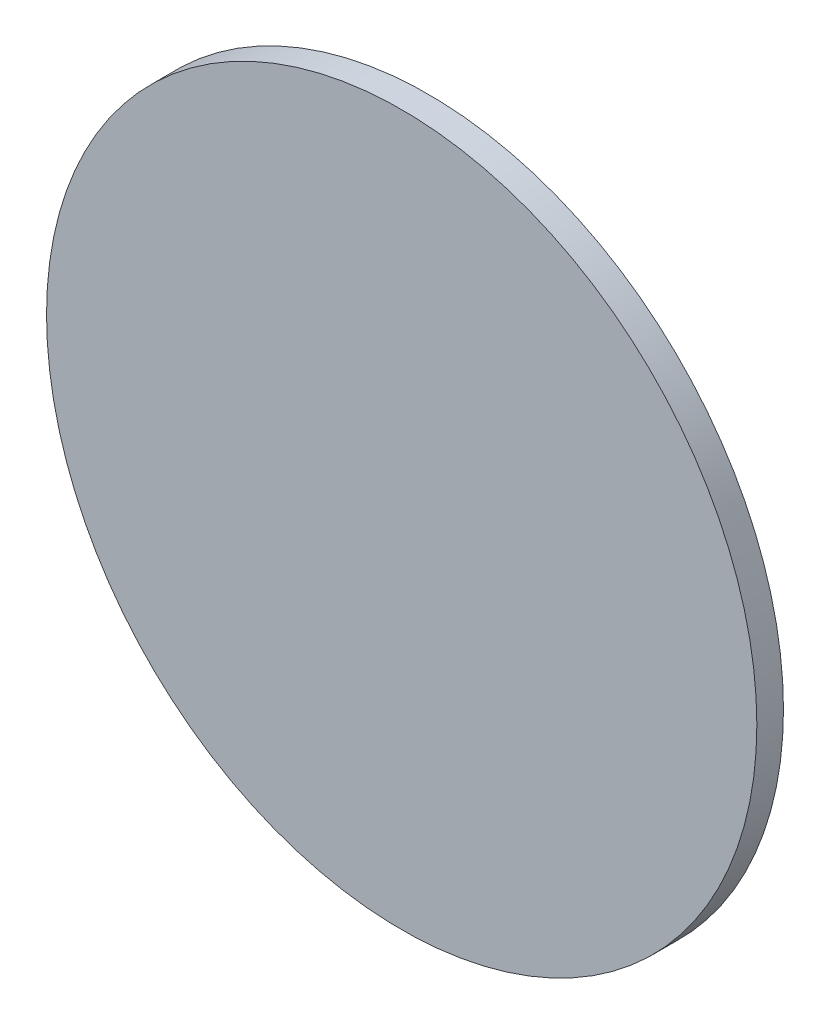
ISO-10303-21;
HEADER;
FILE_DESCRIPTION(('STEP AP214'),'2;1');
FILE_NAME('part.step','',(''),(''),'','','');
FILE_SCHEMA(('AUTOMOTIVE_DESIGN { 1 0 10303 214 1 1 1 1 }'));
ENDSEC;
DATA;
#1=APPLICATION_CONTEXT('core data for automotive mechanical design processes');
#2=APPLICATION_PROTOCOL_DEFINITION('international standard','automotive_design',2000,#1);
#3=PRODUCT_CONTEXT('',#1,'mechanical');
#4=PRODUCT('Part','Part','',(#3));
#5=PRODUCT_RELATED_PRODUCT_CATEGORY('part','',(#4));
#6=PRODUCT_DEFINITION_FORMATION('','',#4);
#7=PRODUCT_DEFINITION_CONTEXT('part definition',#1,'design');
#8=PRODUCT_DEFINITION('design','',#6,#7);
#9=PRODUCT_DEFINITION_SHAPE('','',#8);
#10=(LENGTH_UNIT() NAMED_UNIT(*) SI_UNIT(.MILLI.,.METRE.));
#11=(NAMED_UNIT(*) PLANE_ANGLE_UNIT() SI_UNIT($,.RADIAN.));
#12=(NAMED_UNIT(*) SI_UNIT($,.STERADIAN.) SOLID_ANGLE_UNIT());
#13=UNCERTAINTY_MEASURE_WITH_UNIT(LENGTH_MEASURE(1.E-05),#10,'distance_accuracy_value','');
#14=(GEOMETRIC_REPRESENTATION_CONTEXT(3) GLOBAL_UNCERTAINTY_ASSIGNED_CONTEXT((#13)) GLOBAL_UNIT_ASSIGNED_CONTEXT((#10,
#11,#12)) REPRESENTATION_CONTEXT('',''));
#15=CARTESIAN_POINT('',(0.,0.,0.));
#16=DIRECTION('',(0.,0.,1.));
#17=DIRECTION('',(1.,0.,0.));
#18=AXIS2_PLACEMENT_3D('',#15,#16,#17);
#19=CARTESIAN_POINT('',(-2.675667,4.385569,0.02));
#20=DIRECTION('',(0.,0.,1.));
#21=DIRECTION('',(1.,0.,0.));
#22=AXIS2_PLACEMENT_3D('',#19,#20,#21);
#23=PLANE('',#22);
#24=CARTESIAN_POINT('',(-2.675667,4.385569,0.02));
#25=DIRECTION('',(0.,0.,1.));
#26=DIRECTION('',(1.,0.,0.));
#27=AXIS2_PLACEMENT_3D('',#24,#25,#26);
#28=CIRCLE('',#27,0.266898);
#29=CARTESIAN_POINT('',(-2.942565,4.385569,0.02));
#30=VERTEX_POINT('',#29);
#31=EDGE_CURVE('E11',#30,#30,#28,.T.);
#32=ORIENTED_EDGE('',*,*,#31,.T.);
#33=EDGE_LOOP('',(#32));
#34=FACE_BOUND('',#33,.T.);
#35=ADVANCED_FACE('F17',(#34),#23,.T.);
#36=CARTESIAN_POINT('',(-2.675667,4.385569,0.));
#37=DIRECTION('',(0.,0.,1.));
#38=DIRECTION('',(1.,0.,0.));
#39=AXIS2_PLACEMENT_3D('',#36,#37,#38);
#40=PLANE('',#39);
#41=CARTESIAN_POINT('',(-2.675667,4.385569,0.));
#42=DIRECTION('',(0.,0.,1.));
#43=DIRECTION('',(1.,0.,0.));
#44=AXIS2_PLACEMENT_3D('',#41,#42,#43);
#45=CIRCLE('',#44,0.266898);
#46=CARTESIAN_POINT('',(-2.942565,4.385569,0.));
#47=VERTEX_POINT('',#46);
#48=EDGE_CURVE('E42',#47,#47,#45,.T.);
#49=ORIENTED_EDGE('',*,*,#48,.F.);
#50=EDGE_LOOP('',(#49));
#51=FACE_BOUND('',#50,.T.);
#52=ADVANCED_FACE('F56',(#51),#40,.F.);
#53=CARTESIAN_POINT('',(-2.675667,4.385569,0.));
#54=DIRECTION('',(0.,0.,-1.));
#55=DIRECTION('',(1.,0.,0.));
#56=AXIS2_PLACEMENT_3D('',#53,#54,#55);
#57=CYLINDRICAL_SURFACE('',#56,0.266898);
#58=ORIENTED_EDGE('',*,*,#48,.T.);
#59=DIRECTION('',(0.,0.,1.));
#60=VECTOR('',#59,1.);
#61=CARTESIAN_POINT('',(-2.942565,4.385569,0.));
#62=LINE('',#61,#60);
#63=EDGE_CURVE('E25',#47,#30,#62,.T.);
#64=ORIENTED_EDGE('',*,*,#63,.T.);
#65=ORIENTED_EDGE('',*,*,#31,.F.);
#66=ORIENTED_EDGE('',*,*,#63,.F.);
#67=EDGE_LOOP('',(#58,#64,#65,#66));
#68=FACE_BOUND('',#67,.T.);
#69=ADVANCED_FACE('F40',(#68),#57,.T.);
#70=CLOSED_SHELL('',(#35,#52,#69));
#71=MANIFOLD_SOLID_BREP('B1',#70);
#72=ADVANCED_BREP_SHAPE_REPRESENTATION('',(#18,#71),#14);
#73=SHAPE_DEFINITION_REPRESENTATION(#9,#72);
ENDSEC;
END-ISO-10303-21;
